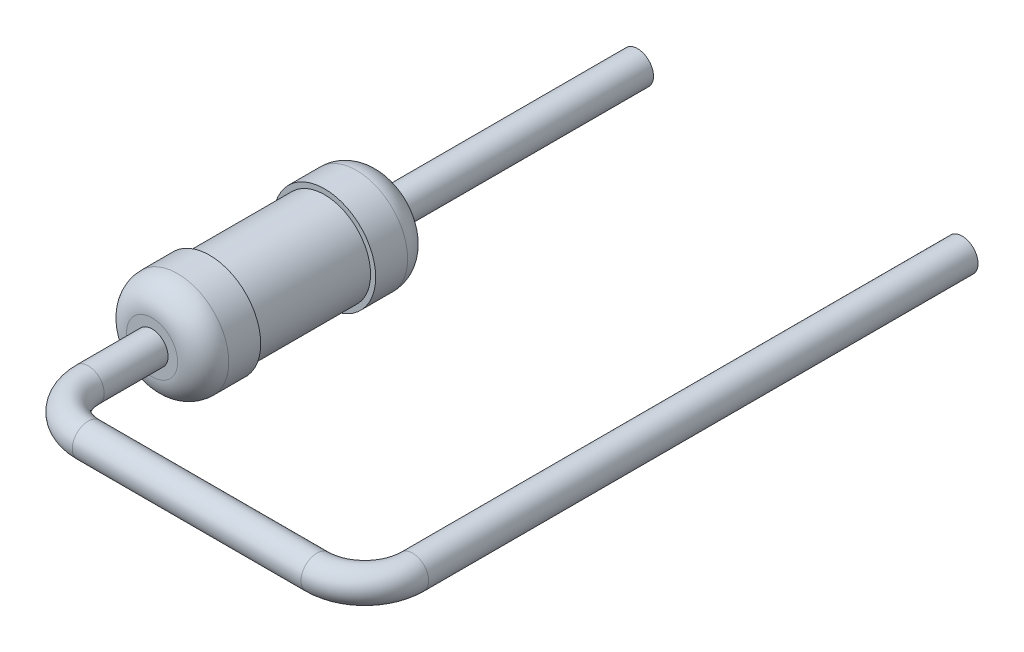
ISO-10303-21;
HEADER;
FILE_DESCRIPTION(('STEP AP214'),'2;1');
FILE_NAME('part.step','',(''),(''),'','','');
FILE_SCHEMA(('AUTOMOTIVE_DESIGN { 1 0 10303 214 1 1 1 1 }'));
ENDSEC;
DATA;
#1=APPLICATION_CONTEXT('core data for automotive mechanical design processes');
#2=APPLICATION_PROTOCOL_DEFINITION('international standard','automotive_design',2000,#1);
#3=PRODUCT_CONTEXT('',#1,'mechanical');
#4=PRODUCT('Part','Part','',(#3));
#5=PRODUCT_RELATED_PRODUCT_CATEGORY('part','',(#4));
#6=PRODUCT_DEFINITION_FORMATION('','',#4);
#7=PRODUCT_DEFINITION_CONTEXT('part definition',#1,'design');
#8=PRODUCT_DEFINITION('design','',#6,#7);
#9=PRODUCT_DEFINITION_SHAPE('','',#8);
#10=(LENGTH_UNIT() NAMED_UNIT(*) SI_UNIT(.MILLI.,.METRE.));
#11=(NAMED_UNIT(*) PLANE_ANGLE_UNIT() SI_UNIT($,.RADIAN.));
#12=(NAMED_UNIT(*) SI_UNIT($,.STERADIAN.) SOLID_ANGLE_UNIT());
#13=UNCERTAINTY_MEASURE_WITH_UNIT(LENGTH_MEASURE(1.E-05),#10,'distance_accuracy_value','');
#14=(GEOMETRIC_REPRESENTATION_CONTEXT(3) GLOBAL_UNCERTAINTY_ASSIGNED_CONTEXT((#13)) GLOBAL_UNIT_ASSIGNED_CONTEXT((#10,
#11,#12)) REPRESENTATION_CONTEXT('',''));
#15=CARTESIAN_POINT('',(0.,0.,0.));
#16=DIRECTION('',(0.,0.,1.));
#17=DIRECTION('',(1.,0.,0.));
#18=AXIS2_PLACEMENT_3D('',#15,#16,#17);
#19=CARTESIAN_POINT('',(0.,0.,1.));
#20=DIRECTION('',(0.,0.,-1.));
#21=DIRECTION('',(1.,0.,0.));
#22=AXIS2_PLACEMENT_3D('',#19,#20,#21);
#23=CYLINDRICAL_SURFACE('',#22,0.8);
#24=CARTESIAN_POINT('',(0.,0.,1.4));
#25=DIRECTION('',(0.,0.,1.));
#26=DIRECTION('',(1.,0.,0.));
#27=AXIS2_PLACEMENT_3D('',#24,#25,#26);
#28=CIRCLE('',#27,0.8);
#29=CARTESIAN_POINT('',(0.8,0.,1.4));
#30=VERTEX_POINT('',#29);
#31=EDGE_CURVE('E11',#30,#30,#28,.T.);
#32=ORIENTED_EDGE('',*,*,#31,.T.);
#33=DIRECTION('',(0.,0.,1.));
#34=VECTOR('',#33,1.);
#35=CARTESIAN_POINT('',(0.8,0.,1.));
#36=LINE('',#35,#34);
#37=CARTESIAN_POINT('',(0.8,0.,1.9));
#38=VERTEX_POINT('',#37);
#39=EDGE_CURVE('E26',#30,#38,#36,.T.);
#40=ORIENTED_EDGE('',*,*,#39,.T.);
#41=CARTESIAN_POINT('',(0.,0.,1.9));
#42=DIRECTION('',(0.,0.,1.));
#43=DIRECTION('',(1.,0.,0.));
#44=AXIS2_PLACEMENT_3D('',#41,#42,#43);
#45=CIRCLE('',#44,0.8);
#46=EDGE_CURVE('E46',#38,#38,#45,.T.);
#47=ORIENTED_EDGE('',*,*,#46,.F.);
#48=ORIENTED_EDGE('',*,*,#39,.F.);
#49=EDGE_LOOP('',(#32,#40,#47,#48));
#50=FACE_BOUND('',#49,.T.);
#51=ADVANCED_FACE('F16',(#50),#23,.T.);
#52=CARTESIAN_POINT('',(0.,0.,1.4));
#53=DIRECTION('',(0.,0.,-1.));
#54=DIRECTION('',(1.,0.,0.));
#55=AXIS2_PLACEMENT_3D('',#52,#53,#54);
#56=DEGENERATE_TOROIDAL_SURFACE('',#55,0.4,0.4,.T.);
#57=CARTESIAN_POINT('',(0.,0.,1.));
#58=DIRECTION('',(0.,0.,1.));
#59=DIRECTION('',(1.,0.,0.));
#60=AXIS2_PLACEMENT_3D('',#57,#58,#59);
#61=CIRCLE('',#60,0.4);
#62=CARTESIAN_POINT('',(0.4,0.,1.));
#63=VERTEX_POINT('',#62);
#64=EDGE_CURVE('E151',#63,#63,#61,.T.);
#65=ORIENTED_EDGE('',*,*,#64,.T.);
#66=CARTESIAN_POINT('',(0.4,0.,1.4));
#67=DIRECTION('',(0.,1.,0.));
#68=DIRECTION('',(1.,0.,0.));
#69=AXIS2_PLACEMENT_3D('',#66,#67,#68);
#70=CIRCLE('',#69,0.4);
#71=EDGE_CURVE('E130',#30,#63,#70,.T.);
#72=ORIENTED_EDGE('',*,*,#71,.F.);
#73=ORIENTED_EDGE('',*,*,#31,.F.);
#74=ORIENTED_EDGE('',*,*,#71,.T.);
#75=EDGE_LOOP('',(#65,#72,#73,#74));
#76=FACE_BOUND('',#75,.T.);
#77=ADVANCED_FACE('F247',(#76),#56,.T.);
#78=CARTESIAN_POINT('',(0.8,0.,1.9));
#79=DIRECTION('',(0.,0.,-1.));
#80=DIRECTION('',(0.,-1.,0.));
#81=AXIS2_PLACEMENT_3D('',#78,#79,#80);
#82=PLANE('',#81);
#83=ORIENTED_EDGE('',*,*,#46,.T.);
#84=EDGE_LOOP('',(#83));
#85=FACE_BOUND('',#84,.T.);
#86=CARTESIAN_POINT('',(0.,0.,1.9));
#87=DIRECTION('',(0.,0.,-1.));
#88=DIRECTION('',(1.,0.,0.));
#89=AXIS2_PLACEMENT_3D('',#86,#87,#88);
#90=CIRCLE('',#89,0.72);
#91=CARTESIAN_POINT('',(0.72,0.,1.9));
#92=VERTEX_POINT('',#91);
#93=EDGE_CURVE('E119',#92,#92,#90,.T.);
#94=ORIENTED_EDGE('',*,*,#93,.T.);
#95=EDGE_LOOP('',(#94));
#96=FACE_BOUND('',#95,.T.);
#97=ADVANCED_FACE('F252',(#85,#96),#82,.F.);
#98=CARTESIAN_POINT('',(0.8,0.,1.));
#99=DIRECTION('',(0.,0.,-1.));
#100=DIRECTION('',(0.,-1.,0.));
#101=AXIS2_PLACEMENT_3D('',#98,#99,#100);
#102=PLANE('',#101);
#103=ORIENTED_EDGE('',*,*,#64,.F.);
#104=EDGE_LOOP('',(#103));
#105=FACE_BOUND('',#104,.T.);
#106=CARTESIAN_POINT('',(0.,0.,1.));
#107=DIRECTION('',(0.,0.,1.));
#108=DIRECTION('',(1.,0.,0.));
#109=AXIS2_PLACEMENT_3D('',#106,#107,#108);
#110=CIRCLE('',#109,0.25);
#111=CARTESIAN_POINT('',(0.25,0.,1.));
#112=VERTEX_POINT('',#111);
#113=EDGE_CURVE('E112',#112,#112,#110,.T.);
#114=ORIENTED_EDGE('',*,*,#113,.T.);
#115=EDGE_LOOP('',(#114));
#116=FACE_BOUND('',#115,.T.);
#117=ADVANCED_FACE('F267',(#105,#116),#102,.T.);
#118=CARTESIAN_POINT('',(0.,0.,1.));
#119=DIRECTION('',(0.,0.,-1.));
#120=DIRECTION('',(1.,0.,0.));
#121=AXIS2_PLACEMENT_3D('',#118,#119,#120);
#122=CYLINDRICAL_SURFACE('',#121,0.72);
#123=CARTESIAN_POINT('',(0.,0.,3.7));
#124=DIRECTION('',(0.,0.,-1.));
#125=DIRECTION('',(1.,0.,0.));
#126=AXIS2_PLACEMENT_3D('',#123,#124,#125);
#127=CIRCLE('',#126,0.72);
#128=CARTESIAN_POINT('',(0.72,0.,3.7));
#129=VERTEX_POINT('',#128);
#130=EDGE_CURVE('E20',#129,#129,#127,.T.);
#131=ORIENTED_EDGE('',*,*,#130,.T.);
#132=DIRECTION('',(0.,0.,1.));
#133=VECTOR('',#132,1.);
#134=CARTESIAN_POINT('',(0.72,0.,1.));
#135=LINE('',#134,#133);
#136=EDGE_CURVE('E122',#92,#129,#135,.T.);
#137=ORIENTED_EDGE('',*,*,#136,.F.);
#138=ORIENTED_EDGE('',*,*,#93,.F.);
#139=ORIENTED_EDGE('',*,*,#136,.T.);
#140=EDGE_LOOP('',(#131,#137,#138,#139));
#141=FACE_BOUND('',#140,.T.);
#142=ADVANCED_FACE('F121',(#141),#122,.T.);
#143=CARTESIAN_POINT('',(0.,0.,-3.));
#144=DIRECTION('',(0.,0.,1.));
#145=DIRECTION('',(1.,0.,0.));
#146=AXIS2_PLACEMENT_3D('',#143,#144,#145);
#147=CYLINDRICAL_SURFACE('',#146,0.25);
#148=CARTESIAN_POINT('',(0.,0.,-3.));
#149=DIRECTION('',(0.,0.,1.));
#150=DIRECTION('',(1.,0.,0.));
#151=AXIS2_PLACEMENT_3D('',#148,#149,#150);
#152=CIRCLE('',#151,0.25);
#153=CARTESIAN_POINT('',(0.25,0.,-3.));
#154=VERTEX_POINT('',#153);
#155=EDGE_CURVE('E168',#154,#154,#152,.T.);
#156=ORIENTED_EDGE('',*,*,#155,.T.);
#157=DIRECTION('',(0.,0.,1.));
#158=VECTOR('',#157,1.);
#159=CARTESIAN_POINT('',(0.25,0.,-3.));
#160=LINE('',#159,#158);
#161=EDGE_CURVE('E141',#154,#112,#160,.T.);
#162=ORIENTED_EDGE('',*,*,#161,.T.);
#163=ORIENTED_EDGE('',*,*,#113,.F.);
#164=ORIENTED_EDGE('',*,*,#161,.F.);
#165=EDGE_LOOP('',(#156,#162,#163,#164));
#166=FACE_BOUND('',#165,.T.);
#167=ADVANCED_FACE('F259',(#166),#147,.T.);
#168=CARTESIAN_POINT('',(0.8,0.,3.7));
#169=DIRECTION('',(0.,0.,-1.));
#170=DIRECTION('',(0.,-1.,0.));
#171=AXIS2_PLACEMENT_3D('',#168,#169,#170);
#172=PLANE('',#171);
#173=CARTESIAN_POINT('',(0.,0.,3.7));
#174=DIRECTION('',(0.,0.,1.));
#175=DIRECTION('',(1.,0.,0.));
#176=AXIS2_PLACEMENT_3D('',#173,#174,#175);
#177=CIRCLE('',#176,0.8);
#178=CARTESIAN_POINT('',(0.8,0.,3.7));
#179=VERTEX_POINT('',#178);
#180=EDGE_CURVE('E138',#179,#179,#177,.T.);
#181=ORIENTED_EDGE('',*,*,#180,.F.);
#182=EDGE_LOOP('',(#181));
#183=FACE_BOUND('',#182,.T.);
#184=ORIENTED_EDGE('',*,*,#130,.F.);
#185=EDGE_LOOP('',(#184));
#186=FACE_BOUND('',#185,.T.);
#187=ADVANCED_FACE('F256',(#183,#186),#172,.T.);
#188=CARTESIAN_POINT('',(0.25,0.,-3.));
#189=DIRECTION('',(0.,0.,-1.));
#190=DIRECTION('',(0.,-1.,0.));
#191=AXIS2_PLACEMENT_3D('',#188,#189,#190);
#192=PLANE('',#191);
#193=ORIENTED_EDGE('',*,*,#155,.F.);
#194=EDGE_LOOP('',(#193));
#195=FACE_BOUND('',#194,.T.);
#196=ADVANCED_FACE('F258',(#195),#192,.T.);
#197=CARTESIAN_POINT('',(0.,0.,3.7));
#198=DIRECTION('',(0.,0.,-1.));
#199=DIRECTION('',(1.,0.,0.));
#200=AXIS2_PLACEMENT_3D('',#197,#198,#199);
#201=CYLINDRICAL_SURFACE('',#200,0.8);
#202=ORIENTED_EDGE('',*,*,#180,.T.);
#203=DIRECTION('',(0.,0.,1.));
#204=VECTOR('',#203,1.);
#205=CARTESIAN_POINT('',(0.8,0.,3.7));
#206=LINE('',#205,#204);
#207=CARTESIAN_POINT('',(0.8,0.,4.2));
#208=VERTEX_POINT('',#207);
#209=EDGE_CURVE('E142',#179,#208,#206,.T.);
#210=ORIENTED_EDGE('',*,*,#209,.T.);
#211=CARTESIAN_POINT('',(0.,0.,4.2));
#212=DIRECTION('',(0.,0.,1.));
#213=DIRECTION('',(1.,0.,0.));
#214=AXIS2_PLACEMENT_3D('',#211,#212,#213);
#215=CIRCLE('',#214,0.8);
#216=EDGE_CURVE('E152',#208,#208,#215,.T.);
#217=ORIENTED_EDGE('',*,*,#216,.F.);
#218=ORIENTED_EDGE('',*,*,#209,.F.);
#219=EDGE_LOOP('',(#202,#210,#217,#218));
#220=FACE_BOUND('',#219,.T.);
#221=ADVANCED_FACE('F242',(#220),#201,.T.);
#222=CARTESIAN_POINT('',(0.,0.,4.2));
#223=DIRECTION('',(0.,0.,1.));
#224=DIRECTION('',(1.,0.,0.));
#225=AXIS2_PLACEMENT_3D('',#222,#223,#224);
#226=DEGENERATE_TOROIDAL_SURFACE('',#225,0.4,0.4,.T.);
#227=CARTESIAN_POINT('',(0.4,0.,4.2));
#228=DIRECTION('',(0.,-1.,0.));
#229=DIRECTION('',(1.,0.,0.));
#230=AXIS2_PLACEMENT_3D('',#227,#228,#229);
#231=CIRCLE('',#230,0.4);
#232=CARTESIAN_POINT('',(0.4,0.,4.6));
#233=VERTEX_POINT('',#232);
#234=EDGE_CURVE('E156',#208,#233,#231,.T.);
#235=ORIENTED_EDGE('',*,*,#234,.F.);
#236=ORIENTED_EDGE('',*,*,#216,.T.);
#237=ORIENTED_EDGE('',*,*,#234,.T.);
#238=CARTESIAN_POINT('',(0.,0.,4.6));
#239=DIRECTION('',(0.,0.,1.));
#240=DIRECTION('',(1.,0.,0.));
#241=AXIS2_PLACEMENT_3D('',#238,#239,#240);
#242=CIRCLE('',#241,0.4);
#243=EDGE_CURVE('E174',#233,#233,#242,.T.);
#244=ORIENTED_EDGE('',*,*,#243,.F.);
#245=EDGE_LOOP('',(#235,#236,#237,#244));
#246=FACE_BOUND('',#245,.T.);
#247=ADVANCED_FACE('F233',(#246),#226,.T.);
#248=CARTESIAN_POINT('',(0.8,0.,4.6));
#249=DIRECTION('',(0.,0.,-1.));
#250=DIRECTION('',(0.,-1.,0.));
#251=AXIS2_PLACEMENT_3D('',#248,#249,#250);
#252=PLANE('',#251);
#253=ORIENTED_EDGE('',*,*,#243,.T.);
#254=EDGE_LOOP('',(#253));
#255=FACE_BOUND('',#254,.T.);
#256=CARTESIAN_POINT('',(0.,0.,4.6));
#257=DIRECTION('',(0.,0.,1.));
#258=DIRECTION('',(1.,0.,0.));
#259=AXIS2_PLACEMENT_3D('',#256,#257,#258);
#260=CIRCLE('',#259,0.25);
#261=CARTESIAN_POINT('',(0.25,0.,4.6));
#262=VERTEX_POINT('',#261);
#263=EDGE_CURVE('E161',#262,#262,#260,.T.);
#264=ORIENTED_EDGE('',*,*,#263,.F.);
#265=EDGE_LOOP('',(#264));
#266=FACE_BOUND('',#265,.T.);
#267=ADVANCED_FACE('F231',(#255,#266),#252,.F.);
#268=CARTESIAN_POINT('',(0.,0.,-3.));
#269=DIRECTION('',(0.,0.,1.));
#270=DIRECTION('',(1.,0.,0.));
#271=AXIS2_PLACEMENT_3D('',#268,#269,#270);
#272=CYLINDRICAL_SURFACE('',#271,0.25);
#273=ORIENTED_EDGE('',*,*,#263,.T.);
#274=DIRECTION('',(0.,0.,1.));
#275=VECTOR('',#274,1.);
#276=CARTESIAN_POINT('',(0.25,0.,-3.));
#277=LINE('',#276,#275);
#278=CARTESIAN_POINT('',(0.25,0.,5.6));
#279=VERTEX_POINT('',#278);
#280=EDGE_CURVE('E157',#262,#279,#277,.T.);
#281=ORIENTED_EDGE('',*,*,#280,.T.);
#282=CARTESIAN_POINT('',(0.,0.,5.6));
#283=DIRECTION('',(0.,0.,1.));
#284=DIRECTION('',(1.,0.,0.));
#285=AXIS2_PLACEMENT_3D('',#282,#283,#284);
#286=CIRCLE('',#285,0.25);
#287=EDGE_CURVE('E146',#279,#279,#286,.T.);
#288=ORIENTED_EDGE('',*,*,#287,.F.);
#289=ORIENTED_EDGE('',*,*,#280,.F.);
#290=EDGE_LOOP('',(#273,#281,#288,#289));
#291=FACE_BOUND('',#290,.T.);
#292=ADVANCED_FACE('F229',(#291),#272,.T.);
#293=CARTESIAN_POINT('',(0.75,0.,5.6));
#294=DIRECTION('',(0.,1.,0.));
#295=DIRECTION('',(-1.,0.,0.));
#296=AXIS2_PLACEMENT_3D('',#293,#294,#295);
#297=TOROIDAL_SURFACE('',#296,0.75,0.25);
#298=CARTESIAN_POINT('',(0.75,0.,5.6));
#299=DIRECTION('',(0.,1.,0.));
#300=DIRECTION('',(-1.,0.,0.));
#301=AXIS2_PLACEMENT_3D('',#298,#299,#300);
#302=CIRCLE('',#301,0.5);
#303=CARTESIAN_POINT('',(0.75,0.,6.1));
#304=VERTEX_POINT('',#303);
#305=EDGE_CURVE('E162',#279,#304,#302,.T.);
#306=ORIENTED_EDGE('',*,*,#305,.T.);
#307=CARTESIAN_POINT('',(0.75,0.,6.35));
#308=DIRECTION('',(-1.,0.,0.));
#309=DIRECTION('',(0.,0.,1.));
#310=AXIS2_PLACEMENT_3D('',#307,#308,#309);
#311=CIRCLE('',#310,0.25);
#312=EDGE_CURVE('E67',#304,#304,#311,.T.);
#313=ORIENTED_EDGE('',*,*,#312,.T.);
#314=ORIENTED_EDGE('',*,*,#305,.F.);
#315=ORIENTED_EDGE('',*,*,#287,.T.);
#316=EDGE_LOOP('',(#306,#313,#314,#315));
#317=FACE_BOUND('',#316,.T.);
#318=ADVANCED_FACE('F18',(#317),#297,.T.);
#319=CARTESIAN_POINT('',(0.75,0.,6.35));
#320=DIRECTION('',(1.,0.,0.));
#321=DIRECTION('',(0.,0.,-1.));
#322=AXIS2_PLACEMENT_3D('',#319,#320,#321);
#323=CYLINDRICAL_SURFACE('',#322,0.25);
#324=DIRECTION('',(1.,0.,0.));
#325=VECTOR('',#324,1.);
#326=CARTESIAN_POINT('',(0.75,0.,6.1));
#327=LINE('',#326,#325);
#328=CARTESIAN_POINT('',(4.33,0.,6.1));
#329=VERTEX_POINT('',#328);
#330=EDGE_CURVE('E143',#304,#329,#327,.T.);
#331=ORIENTED_EDGE('',*,*,#330,.T.);
#332=CARTESIAN_POINT('',(4.33,0.,6.35));
#333=DIRECTION('',(1.,0.,0.));
#334=DIRECTION('',(0.,0.,-1.));
#335=AXIS2_PLACEMENT_3D('',#332,#333,#334);
#336=CIRCLE('',#335,0.25);
#337=EDGE_CURVE('E78',#329,#329,#336,.T.);
#338=ORIENTED_EDGE('',*,*,#337,.F.);
#339=ORIENTED_EDGE('',*,*,#330,.F.);
#340=ORIENTED_EDGE('',*,*,#312,.F.);
#341=EDGE_LOOP('',(#331,#338,#339,#340));
#342=FACE_BOUND('',#341,.T.);
#343=ADVANCED_FACE('F262',(#342),#323,.T.);
#344=CARTESIAN_POINT('',(4.33,0.,5.6));
#345=DIRECTION('',(0.,1.,0.));
#346=DIRECTION('',(0.,0.,1.));
#347=AXIS2_PLACEMENT_3D('',#344,#345,#346);
#348=TOROIDAL_SURFACE('',#347,0.75,0.25);
#349=CARTESIAN_POINT('',(4.33,0.,5.6));
#350=DIRECTION('',(0.,1.,0.));
#351=DIRECTION('',(0.,0.,1.));
#352=AXIS2_PLACEMENT_3D('',#349,#350,#351);
#353=CIRCLE('',#352,0.5);
#354=CARTESIAN_POINT('',(4.83,0.,5.6));
#355=VERTEX_POINT('',#354);
#356=EDGE_CURVE('E147',#329,#355,#353,.T.);
#357=ORIENTED_EDGE('',*,*,#356,.T.);
#358=CARTESIAN_POINT('',(5.08,0.,5.6));
#359=DIRECTION('',(0.,0.,1.));
#360=DIRECTION('',(1.,0.,0.));
#361=AXIS2_PLACEMENT_3D('',#358,#359,#360);
#362=CIRCLE('',#361,0.25);
#363=EDGE_CURVE('E184',#355,#355,#362,.T.);
#364=ORIENTED_EDGE('',*,*,#363,.T.);
#365=ORIENTED_EDGE('',*,*,#356,.F.);
#366=ORIENTED_EDGE('',*,*,#337,.T.);
#367=EDGE_LOOP('',(#357,#364,#365,#366));
#368=FACE_BOUND('',#367,.T.);
#369=ADVANCED_FACE('F201',(#368),#348,.T.);
#370=CARTESIAN_POINT('',(5.08,0.,5.6));
#371=DIRECTION('',(0.,0.,-1.));
#372=DIRECTION('',(-1.,0.,0.));
#373=AXIS2_PLACEMENT_3D('',#370,#371,#372);
#374=CYLINDRICAL_SURFACE('',#373,0.25);
#375=DIRECTION('',(0.,0.,-1.));
#376=VECTOR('',#375,1.);
#377=CARTESIAN_POINT('',(4.83,0.,5.6));
#378=LINE('',#377,#376);
#379=CARTESIAN_POINT('',(4.83,0.,-3.));
#380=VERTEX_POINT('',#379);
#381=EDGE_CURVE('E192',#355,#380,#378,.T.);
#382=ORIENTED_EDGE('',*,*,#381,.T.);
#383=CARTESIAN_POINT('',(5.08,0.,-3.));
#384=DIRECTION('',(0.,0.,-1.));
#385=DIRECTION('',(-1.,0.,0.));
#386=AXIS2_PLACEMENT_3D('',#383,#384,#385);
#387=CIRCLE('',#386,0.25);
#388=EDGE_CURVE('E136',#380,#380,#387,.T.);
#389=ORIENTED_EDGE('',*,*,#388,.F.);
#390=ORIENTED_EDGE('',*,*,#381,.F.);
#391=ORIENTED_EDGE('',*,*,#363,.F.);
#392=EDGE_LOOP('',(#382,#389,#390,#391));
#393=FACE_BOUND('',#392,.T.);
#394=ADVANCED_FACE('F204',(#393),#374,.T.);
#395=CARTESIAN_POINT('',(4.83,0.,-3.));
#396=DIRECTION('',(0.,0.,1.));
#397=DIRECTION('',(1.,0.,0.));
#398=AXIS2_PLACEMENT_3D('',#395,#396,#397);
#399=PLANE('',#398);
#400=ORIENTED_EDGE('',*,*,#388,.T.);
#401=EDGE_LOOP('',(#400));
#402=FACE_BOUND('',#401,.T.);
#403=ADVANCED_FACE('F275',(#402),#399,.F.);
#404=CLOSED_SHELL('',(#51,#77,#97,#117,#142,#167,#187,#196,#221,#247,#267,#292,#318,#343,#369,
#394,#403));
#405=MANIFOLD_SOLID_BREP('B1',#404);
#406=ADVANCED_BREP_SHAPE_REPRESENTATION('',(#18,#405),#14);
#407=SHAPE_DEFINITION_REPRESENTATION(#9,#406);
ENDSEC;
END-ISO-10303-21;
